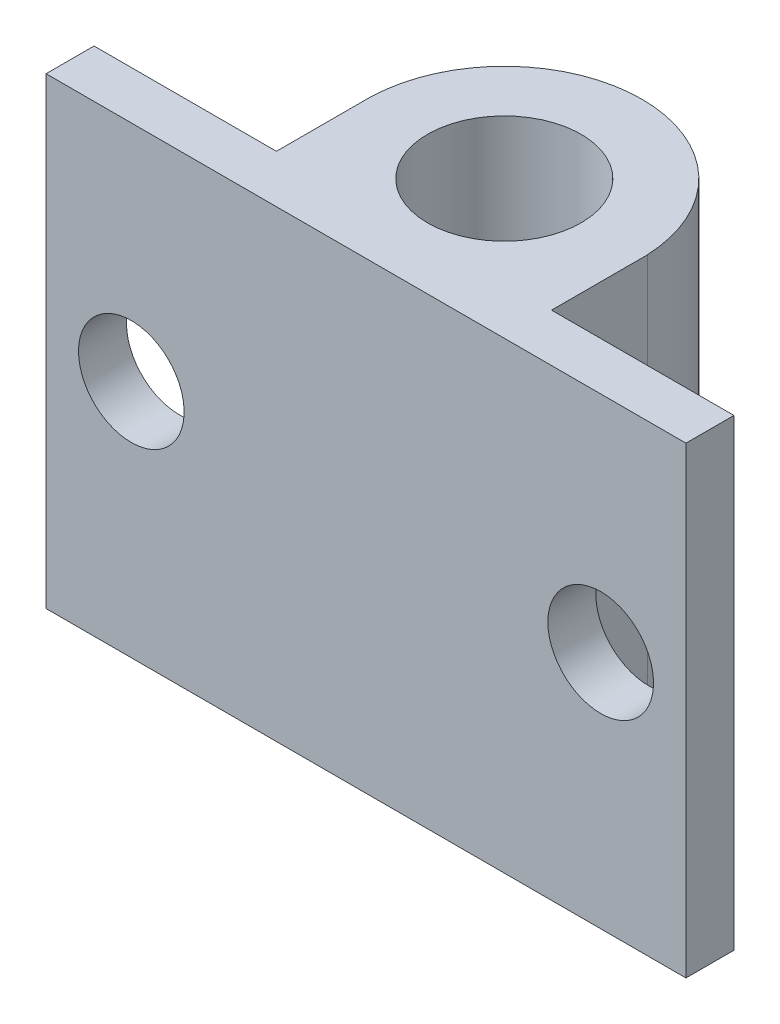
ISO-10303-21;
HEADER;
FILE_DESCRIPTION(('STEP AP214'),'2;1');
FILE_NAME('part.step','',(''),(''),'','','');
FILE_SCHEMA(('AUTOMOTIVE_DESIGN { 1 0 10303 214 1 1 1 1 }'));
ENDSEC;
DATA;
#1=APPLICATION_CONTEXT('core data for automotive mechanical design processes');
#2=APPLICATION_PROTOCOL_DEFINITION('international standard','automotive_design',2000,#1);
#3=PRODUCT_CONTEXT('',#1,'mechanical');
#4=PRODUCT('Part','Part','',(#3));
#5=PRODUCT_RELATED_PRODUCT_CATEGORY('part','',(#4));
#6=PRODUCT_DEFINITION_FORMATION('','',#4);
#7=PRODUCT_DEFINITION_CONTEXT('part definition',#1,'design');
#8=PRODUCT_DEFINITION('design','',#6,#7);
#9=PRODUCT_DEFINITION_SHAPE('','',#8);
#10=(LENGTH_UNIT() NAMED_UNIT(*) SI_UNIT(.MILLI.,.METRE.));
#11=(NAMED_UNIT(*) PLANE_ANGLE_UNIT() SI_UNIT($,.RADIAN.));
#12=(NAMED_UNIT(*) SI_UNIT($,.STERADIAN.) SOLID_ANGLE_UNIT());
#13=UNCERTAINTY_MEASURE_WITH_UNIT(LENGTH_MEASURE(1.E-05),#10,'distance_accuracy_value','');
#14=(GEOMETRIC_REPRESENTATION_CONTEXT(3) GLOBAL_UNCERTAINTY_ASSIGNED_CONTEXT((#13)) GLOBAL_UNIT_ASSIGNED_CONTEXT((#10,
#11,#12)) REPRESENTATION_CONTEXT('',''));
#15=CARTESIAN_POINT('',(0.,0.,0.));
#16=DIRECTION('',(0.,0.,1.));
#17=DIRECTION('',(1.,0.,0.));
#18=AXIS2_PLACEMENT_3D('',#15,#16,#17);
#19=CARTESIAN_POINT('',(-10.,14.478,4.32278570050431));
#20=DIRECTION('',(0.,0.,-1.));
#21=DIRECTION('',(-1.,0.,0.));
#22=AXIS2_PLACEMENT_3D('',#19,#20,#21);
#23=PLANE('',#22);
#24=CARTESIAN_POINT('',(-7.33556817238237,7.478,4.32278570050431));
#25=DIRECTION('',(0.,0.,-1.));
#26=DIRECTION('',(-1.,0.,0.));
#27=AXIS2_PLACEMENT_3D('',#24,#25,#26);
#28=CIRCLE('',#27,1.651);
#29=CARTESIAN_POINT('',(-8.98656817238237,7.478,4.32278570050431));
#30=VERTEX_POINT('',#29);
#31=EDGE_CURVE('E234',#30,#30,#28,.T.);
#32=ORIENTED_EDGE('',*,*,#31,.T.);
#33=EDGE_LOOP('',(#32));
#34=FACE_BOUND('',#33,.T.);
#35=DIRECTION('',(1.,0.,0.));
#36=VECTOR('',#35,1.);
#37=CARTESIAN_POINT('',(-10.,0.,4.32278570050431));
#38=LINE('',#37,#36);
#39=CARTESIAN_POINT('',(-10.,0.,4.32278570050431));
#40=VERTEX_POINT('',#39);
#41=CARTESIAN_POINT('',(10.,0.,4.32278570050431));
#42=VERTEX_POINT('',#41);
#43=EDGE_CURVE('E212',#40,#42,#38,.T.);
#44=ORIENTED_EDGE('',*,*,#43,.T.);
#45=DIRECTION('',(0.,-1.,0.));
#46=VECTOR('',#45,1.);
#47=CARTESIAN_POINT('',(10.,14.478,4.32278570050431));
#48=LINE('',#47,#46);
#49=CARTESIAN_POINT('',(10.,14.478,4.32278570050431));
#50=VERTEX_POINT('',#49);
#51=EDGE_CURVE('E229',#50,#42,#48,.T.);
#52=ORIENTED_EDGE('',*,*,#51,.F.);
#53=DIRECTION('',(1.,0.,0.));
#54=VECTOR('',#53,1.);
#55=CARTESIAN_POINT('',(-10.,14.478,4.32278570050431));
#56=LINE('',#55,#54);
#57=CARTESIAN_POINT('',(-10.,14.478,4.32278570050431));
#58=VERTEX_POINT('',#57);
#59=EDGE_CURVE('E197',#58,#50,#56,.T.);
#60=ORIENTED_EDGE('',*,*,#59,.F.);
#61=DIRECTION('',(0.,-1.,0.));
#62=VECTOR('',#61,1.);
#63=CARTESIAN_POINT('',(-10.,14.478,4.32278570050431));
#64=LINE('',#63,#62);
#65=EDGE_CURVE('E190',#58,#40,#64,.T.);
#66=ORIENTED_EDGE('',*,*,#65,.T.);
#67=EDGE_LOOP('',(#44,#52,#60,#66));
#68=FACE_BOUND('',#67,.T.);
#69=CARTESIAN_POINT('',(7.33556817238237,7.478,4.32278570050431));
#70=DIRECTION('',(0.,0.,-1.));
#71=DIRECTION('',(-1.,0.,0.));
#72=AXIS2_PLACEMENT_3D('',#69,#70,#71);
#73=CIRCLE('',#72,1.651);
#74=CARTESIAN_POINT('',(5.68456817238237,7.478,4.32278570050431));
#75=VERTEX_POINT('',#74);
#76=EDGE_CURVE('E45',#75,#75,#73,.F.);
#77=ORIENTED_EDGE('',*,*,#76,.F.);
#78=EDGE_LOOP('',(#77));
#79=FACE_BOUND('',#78,.T.);
#80=ADVANCED_FACE('F41',(#34,#68,#79),#23,.F.);
#81=CARTESIAN_POINT('',(-10.,14.478,2.82278570050431));
#82=DIRECTION('',(0.,0.,-1.));
#83=DIRECTION('',(-1.,0.,0.));
#84=AXIS2_PLACEMENT_3D('',#81,#82,#83);
#85=PLANE('',#84);
#86=CARTESIAN_POINT('',(-7.33556817238237,7.478,2.82278570050431));
#87=DIRECTION('',(0.,0.,-1.));
#88=DIRECTION('',(-1.,0.,0.));
#89=AXIS2_PLACEMENT_3D('',#86,#87,#88);
#90=CIRCLE('',#89,1.651);
#91=CARTESIAN_POINT('',(-8.98656817238237,7.478,2.82278570050431));
#92=VERTEX_POINT('',#91);
#93=EDGE_CURVE('E244',#92,#92,#90,.T.);
#94=ORIENTED_EDGE('',*,*,#93,.F.);
#95=EDGE_LOOP('',(#94));
#96=FACE_BOUND('',#95,.T.);
#97=DIRECTION('',(1.,0.,0.));
#98=VECTOR('',#97,1.);
#99=CARTESIAN_POINT('',(-10.,14.478,2.82278570050431));
#100=LINE('',#99,#98);
#101=CARTESIAN_POINT('',(-10.,14.478,2.82278570050431));
#102=VERTEX_POINT('',#101);
#103=CARTESIAN_POINT('',(-4.3,14.478,2.82278570050431));
#104=VERTEX_POINT('',#103);
#105=EDGE_CURVE('E205',#102,#104,#100,.T.);
#106=ORIENTED_EDGE('',*,*,#105,.T.);
#107=DIRECTION('',(0.,1.,0.));
#108=VECTOR('',#107,1.);
#109=CARTESIAN_POINT('',(-4.3,14.478,2.82278570050431));
#110=LINE('',#109,#108);
#111=CARTESIAN_POINT('',(-4.3,0.,2.82278570050431));
#112=VERTEX_POINT('',#111);
#113=EDGE_CURVE('E142',#112,#104,#110,.T.);
#114=ORIENTED_EDGE('',*,*,#113,.F.);
#115=DIRECTION('',(1.,0.,0.));
#116=VECTOR('',#115,1.);
#117=CARTESIAN_POINT('',(-10.,0.,2.82278570050431));
#118=LINE('',#117,#116);
#119=CARTESIAN_POINT('',(-10.,0.,2.82278570050431));
#120=VERTEX_POINT('',#119);
#121=EDGE_CURVE('E128',#120,#112,#118,.T.);
#122=ORIENTED_EDGE('',*,*,#121,.F.);
#123=DIRECTION('',(0.,-1.,0.));
#124=VECTOR('',#123,1.);
#125=CARTESIAN_POINT('',(-10.,14.478,2.82278570050431));
#126=LINE('',#125,#124);
#127=EDGE_CURVE('E208',#102,#120,#126,.T.);
#128=ORIENTED_EDGE('',*,*,#127,.F.);
#129=EDGE_LOOP('',(#106,#114,#122,#128));
#130=FACE_BOUND('',#129,.T.);
#131=ADVANCED_FACE('F255',(#96,#130),#85,.T.);
#132=CARTESIAN_POINT('',(0.,14.478,0.));
#133=DIRECTION('',(0.,-1.,0.));
#134=DIRECTION('',(0.,0.,-1.));
#135=AXIS2_PLACEMENT_3D('',#132,#133,#134);
#136=CYLINDRICAL_SURFACE('',#135,4.3);
#137=CARTESIAN_POINT('',(0.,0.,0.));
#138=DIRECTION('',(0.,1.,0.));
#139=DIRECTION('',(0.,0.,1.));
#140=AXIS2_PLACEMENT_3D('',#137,#138,#139);
#141=CIRCLE('',#140,4.3);
#142=CARTESIAN_POINT('',(4.2963467146,0.,-0.177214299495691));
#143=VERTEX_POINT('',#142);
#144=CARTESIAN_POINT('',(-4.2963467146,0.,-0.177214299495691));
#145=VERTEX_POINT('',#144);
#146=EDGE_CURVE('E63',#143,#145,#141,.T.);
#147=ORIENTED_EDGE('',*,*,#146,.T.);
#148=DIRECTION('',(0.,-1.,0.));
#149=VECTOR('',#148,1.);
#150=CARTESIAN_POINT('',(-4.2963467146,14.478,-0.177214299495691));
#151=LINE('',#150,#149);
#152=CARTESIAN_POINT('',(-4.2963467146,14.478,-0.177214299495691));
#153=VERTEX_POINT('',#152);
#154=EDGE_CURVE('E59',#145,#153,#151,.F.);
#155=ORIENTED_EDGE('',*,*,#154,.T.);
#156=CARTESIAN_POINT('',(0.,14.478,0.));
#157=DIRECTION('',(0.,1.,0.));
#158=DIRECTION('',(0.,0.,1.));
#159=AXIS2_PLACEMENT_3D('',#156,#157,#158);
#160=CIRCLE('',#159,4.3);
#161=CARTESIAN_POINT('',(4.2963467146,14.478,-0.177214299495691));
#162=VERTEX_POINT('',#161);
#163=EDGE_CURVE('E11',#162,#153,#160,.T.);
#164=ORIENTED_EDGE('',*,*,#163,.F.);
#165=DIRECTION('',(0.,-1.,0.));
#166=VECTOR('',#165,1.);
#167=CARTESIAN_POINT('',(4.2963467146,14.478,-0.177214299495691));
#168=LINE('',#167,#166);
#169=EDGE_CURVE('E179',#143,#162,#168,.F.);
#170=ORIENTED_EDGE('',*,*,#169,.F.);
#171=EDGE_LOOP('',(#147,#155,#164,#170));
#172=FACE_BOUND('',#171,.T.);
#173=ADVANCED_FACE('F258',(#172),#136,.T.);
#174=CARTESIAN_POINT('',(7.33556817238237,7.478,2.82278570050431));
#175=DIRECTION('',(0.,0.,-1.));
#176=DIRECTION('',(-1.,0.,0.));
#177=AXIS2_PLACEMENT_3D('',#174,#175,#176);
#178=CIRCLE('',#177,1.651);
#179=CARTESIAN_POINT('',(5.68456817238237,7.478,2.82278570050431));
#180=VERTEX_POINT('',#179);
#181=EDGE_CURVE('E237',#180,#180,#178,.F.);
#182=ORIENTED_EDGE('',*,*,#181,.T.);
#183=EDGE_LOOP('',(#182));
#184=FACE_BOUND('',#183,.T.);
#185=CARTESIAN_POINT('',(4.3,0.,2.82278570050431));
#186=VERTEX_POINT('',#185);
#187=CARTESIAN_POINT('',(10.,0.,2.82278570050431));
#188=VERTEX_POINT('',#187);
#189=EDGE_CURVE('E220',#186,#188,#118,.T.);
#190=ORIENTED_EDGE('',*,*,#189,.F.);
#191=DIRECTION('',(0.,-1.,0.));
#192=VECTOR('',#191,1.);
#193=CARTESIAN_POINT('',(4.3,14.478,2.82278570050431));
#194=LINE('',#193,#192);
#195=CARTESIAN_POINT('',(4.3,14.478,2.82278570050431));
#196=VERTEX_POINT('',#195);
#197=EDGE_CURVE('E159',#196,#186,#194,.T.);
#198=ORIENTED_EDGE('',*,*,#197,.F.);
#199=CARTESIAN_POINT('',(10.,14.478,2.82278570050431));
#200=VERTEX_POINT('',#199);
#201=EDGE_CURVE('E204',#196,#200,#100,.T.);
#202=ORIENTED_EDGE('',*,*,#201,.T.);
#203=DIRECTION('',(0.,-1.,0.));
#204=VECTOR('',#203,1.);
#205=CARTESIAN_POINT('',(10.,14.478,2.82278570050431));
#206=LINE('',#205,#204);
#207=EDGE_CURVE('E225',#200,#188,#206,.T.);
#208=ORIENTED_EDGE('',*,*,#207,.T.);
#209=EDGE_LOOP('',(#190,#198,#202,#208));
#210=FACE_BOUND('',#209,.T.);
#211=ADVANCED_FACE('F260',(#184,#210),#85,.T.);
#212=CARTESIAN_POINT('',(0.,14.478,0.));
#213=DIRECTION('',(0.,-1.,0.));
#214=DIRECTION('',(0.,0.,-1.));
#215=AXIS2_PLACEMENT_3D('',#212,#213,#214);
#216=CYLINDRICAL_SURFACE('',#215,2.4);
#217=CARTESIAN_POINT('',(0.,14.478,0.));
#218=DIRECTION('',(0.,1.,0.));
#219=DIRECTION('',(0.,0.,1.));
#220=AXIS2_PLACEMENT_3D('',#217,#218,#219);
#221=CIRCLE('',#220,2.4);
#222=CARTESIAN_POINT('',(0.,14.478,2.4));
#223=VERTEX_POINT('',#222);
#224=EDGE_CURVE('E51',#223,#223,#221,.T.);
#225=ORIENTED_EDGE('',*,*,#224,.T.);
#226=EDGE_LOOP('',(#225));
#227=FACE_BOUND('',#226,.T.);
#228=CARTESIAN_POINT('',(0.,0.,0.));
#229=DIRECTION('',(0.,1.,0.));
#230=DIRECTION('',(0.,0.,1.));
#231=AXIS2_PLACEMENT_3D('',#228,#229,#230);
#232=CIRCLE('',#231,2.4);
#233=CARTESIAN_POINT('',(0.,0.,2.4));
#234=VERTEX_POINT('',#233);
#235=EDGE_CURVE('E186',#234,#234,#232,.T.);
#236=ORIENTED_EDGE('',*,*,#235,.F.);
#237=EDGE_LOOP('',(#236));
#238=FACE_BOUND('',#237,.T.);
#239=ADVANCED_FACE('F297',(#227,#238),#216,.F.);
#240=CARTESIAN_POINT('',(0.,14.478,0.));
#241=DIRECTION('',(0.,1.,0.));
#242=DIRECTION('',(0.,0.,1.));
#243=AXIS2_PLACEMENT_3D('',#240,#241,#242);
#244=PLANE('',#243);
#245=DIRECTION('',(1.,0.,0.));
#246=VECTOR('',#245,1.);
#247=CARTESIAN_POINT('',(-3.24374488655141,14.478,-0.177214299495691));
#248=LINE('',#247,#246);
#249=CARTESIAN_POINT('',(-4.3,14.478,-0.177214299495691));
#250=VERTEX_POINT('',#249);
#251=EDGE_CURVE('E147',#250,#153,#248,.T.);
#252=ORIENTED_EDGE('',*,*,#251,.F.);
#253=DIRECTION('',(0.,0.,1.));
#254=VECTOR('',#253,1.);
#255=CARTESIAN_POINT('',(-4.3,14.478,-0.177214299495691));
#256=LINE('',#255,#254);
#257=EDGE_CURVE('E133',#250,#104,#256,.T.);
#258=ORIENTED_EDGE('',*,*,#257,.T.);
#259=ORIENTED_EDGE('',*,*,#105,.F.);
#260=DIRECTION('',(0.,0.,1.));
#261=VECTOR('',#260,1.);
#262=CARTESIAN_POINT('',(-10.,14.478,2.82278570050431));
#263=LINE('',#262,#261);
#264=EDGE_CURVE('E193',#102,#58,#263,.T.);
#265=ORIENTED_EDGE('',*,*,#264,.T.);
#266=ORIENTED_EDGE('',*,*,#59,.T.);
#267=DIRECTION('',(0.,0.,1.));
#268=VECTOR('',#267,1.);
#269=CARTESIAN_POINT('',(10.,14.478,2.82278570050431));
#270=LINE('',#269,#268);
#271=EDGE_CURVE('E200',#200,#50,#270,.T.);
#272=ORIENTED_EDGE('',*,*,#271,.F.);
#273=ORIENTED_EDGE('',*,*,#201,.F.);
#274=DIRECTION('',(0.,0.,1.));
#275=VECTOR('',#274,1.);
#276=CARTESIAN_POINT('',(4.3,14.478,-0.177214299495691));
#277=LINE('',#276,#275);
#278=CARTESIAN_POINT('',(4.3,14.478,-0.177214299495691));
#279=VERTEX_POINT('',#278);
#280=EDGE_CURVE('E176',#279,#196,#277,.T.);
#281=ORIENTED_EDGE('',*,*,#280,.F.);
#282=DIRECTION('',(1.,0.,0.));
#283=VECTOR('',#282,1.);
#284=CARTESIAN_POINT('',(3.24374488655141,14.478,-0.177214299495691));
#285=LINE('',#284,#283);
#286=EDGE_CURVE('E160',#162,#279,#285,.T.);
#287=ORIENTED_EDGE('',*,*,#286,.F.);
#288=ORIENTED_EDGE('',*,*,#163,.T.);
#289=EDGE_LOOP('',(#252,#258,#259,#265,#266,#272,#273,#281,#287,#288));
#290=FACE_BOUND('',#289,.T.);
#291=ORIENTED_EDGE('',*,*,#224,.F.);
#292=EDGE_LOOP('',(#291));
#293=FACE_BOUND('',#292,.T.);
#294=ADVANCED_FACE('F264',(#290,#293),#244,.T.);
#295=CARTESIAN_POINT('',(0.,0.,0.));
#296=DIRECTION('',(0.,1.,0.));
#297=DIRECTION('',(0.,0.,1.));
#298=AXIS2_PLACEMENT_3D('',#295,#296,#297);
#299=PLANE('',#298);
#300=DIRECTION('',(0.,0.,1.));
#301=VECTOR('',#300,1.);
#302=CARTESIAN_POINT('',(-4.3,0.,-0.177214299495691));
#303=LINE('',#302,#301);
#304=CARTESIAN_POINT('',(-4.3,0.,-0.177214299495691));
#305=VERTEX_POINT('',#304);
#306=EDGE_CURVE('E121',#305,#112,#303,.T.);
#307=ORIENTED_EDGE('',*,*,#306,.F.);
#308=DIRECTION('',(-1.,0.,0.));
#309=VECTOR('',#308,1.);
#310=CARTESIAN_POINT('',(-3.24374488655141,0.,-0.177214299495691));
#311=LINE('',#310,#309);
#312=EDGE_CURVE('E125',#145,#305,#311,.T.);
#313=ORIENTED_EDGE('',*,*,#312,.F.);
#314=ORIENTED_EDGE('',*,*,#146,.F.);
#315=DIRECTION('',(-1.,0.,0.));
#316=VECTOR('',#315,1.);
#317=CARTESIAN_POINT('',(3.24374488655141,0.,-0.177214299495691));
#318=LINE('',#317,#316);
#319=CARTESIAN_POINT('',(4.3,0.,-0.177214299495691));
#320=VERTEX_POINT('',#319);
#321=EDGE_CURVE('E167',#320,#143,#318,.T.);
#322=ORIENTED_EDGE('',*,*,#321,.F.);
#323=DIRECTION('',(0.,0.,1.));
#324=VECTOR('',#323,1.);
#325=CARTESIAN_POINT('',(4.3,0.,-0.177214299495691));
#326=LINE('',#325,#324);
#327=EDGE_CURVE('E170',#320,#186,#326,.T.);
#328=ORIENTED_EDGE('',*,*,#327,.T.);
#329=ORIENTED_EDGE('',*,*,#189,.T.);
#330=DIRECTION('',(0.,0.,1.));
#331=VECTOR('',#330,1.);
#332=CARTESIAN_POINT('',(10.,0.,2.82278570050431));
#333=LINE('',#332,#331);
#334=EDGE_CURVE('E216',#188,#42,#333,.T.);
#335=ORIENTED_EDGE('',*,*,#334,.T.);
#336=ORIENTED_EDGE('',*,*,#43,.F.);
#337=DIRECTION('',(0.,0.,1.));
#338=VECTOR('',#337,1.);
#339=CARTESIAN_POINT('',(-10.,0.,2.82278570050431));
#340=LINE('',#339,#338);
#341=EDGE_CURVE('E182',#120,#40,#340,.T.);
#342=ORIENTED_EDGE('',*,*,#341,.F.);
#343=ORIENTED_EDGE('',*,*,#121,.T.);
#344=EDGE_LOOP('',(#307,#313,#314,#322,#328,#329,#335,#336,#342,#343));
#345=FACE_BOUND('',#344,.T.);
#346=ORIENTED_EDGE('',*,*,#235,.T.);
#347=EDGE_LOOP('',(#346));
#348=FACE_BOUND('',#347,.T.);
#349=ADVANCED_FACE('F123',(#345,#348),#299,.F.);
#350=CARTESIAN_POINT('',(10.,14.478,2.82278570050431));
#351=DIRECTION('',(1.,0.,0.));
#352=DIRECTION('',(0.,0.,-1.));
#353=AXIS2_PLACEMENT_3D('',#350,#351,#352);
#354=PLANE('',#353);
#355=ORIENTED_EDGE('',*,*,#334,.F.);
#356=ORIENTED_EDGE('',*,*,#207,.F.);
#357=ORIENTED_EDGE('',*,*,#271,.T.);
#358=ORIENTED_EDGE('',*,*,#51,.T.);
#359=EDGE_LOOP('',(#355,#356,#357,#358));
#360=FACE_BOUND('',#359,.T.);
#361=ADVANCED_FACE('F284',(#360),#354,.T.);
#362=CARTESIAN_POINT('',(-10.,14.478,2.82278570050431));
#363=DIRECTION('',(1.,0.,0.));
#364=DIRECTION('',(0.,0.,-1.));
#365=AXIS2_PLACEMENT_3D('',#362,#363,#364);
#366=PLANE('',#365);
#367=ORIENTED_EDGE('',*,*,#341,.T.);
#368=ORIENTED_EDGE('',*,*,#65,.F.);
#369=ORIENTED_EDGE('',*,*,#264,.F.);
#370=ORIENTED_EDGE('',*,*,#127,.T.);
#371=EDGE_LOOP('',(#367,#368,#369,#370));
#372=FACE_BOUND('',#371,.T.);
#373=ADVANCED_FACE('F43',(#372),#366,.F.);
#374=CARTESIAN_POINT('',(0.,0.,-0.177214299495691));
#375=DIRECTION('',(0.,0.,1.));
#376=DIRECTION('',(1.,0.,0.));
#377=AXIS2_PLACEMENT_3D('',#374,#375,#376);
#378=PLANE('',#377);
#379=ORIENTED_EDGE('',*,*,#321,.T.);
#380=ORIENTED_EDGE('',*,*,#169,.T.);
#381=ORIENTED_EDGE('',*,*,#286,.T.);
#382=DIRECTION('',(0.,-1.,0.));
#383=VECTOR('',#382,1.);
#384=CARTESIAN_POINT('',(4.3,14.478,-0.177214299495691));
#385=LINE('',#384,#383);
#386=EDGE_CURVE('E163',#279,#320,#385,.T.);
#387=ORIENTED_EDGE('',*,*,#386,.T.);
#388=EDGE_LOOP('',(#379,#380,#381,#387));
#389=FACE_BOUND('',#388,.T.);
#390=ADVANCED_FACE('F271',(#389),#378,.F.);
#391=CARTESIAN_POINT('',(4.3,14.478,-0.177214299495691));
#392=DIRECTION('',(-1.,0.,0.));
#393=DIRECTION('',(0.,0.,1.));
#394=AXIS2_PLACEMENT_3D('',#391,#392,#393);
#395=PLANE('',#394);
#396=ORIENTED_EDGE('',*,*,#280,.T.);
#397=ORIENTED_EDGE('',*,*,#197,.T.);
#398=ORIENTED_EDGE('',*,*,#327,.F.);
#399=ORIENTED_EDGE('',*,*,#386,.F.);
#400=EDGE_LOOP('',(#396,#397,#398,#399));
#401=FACE_BOUND('',#400,.T.);
#402=ADVANCED_FACE('F274',(#401),#395,.F.);
#403=CARTESIAN_POINT('',(0.,0.,-0.177214299495691));
#404=DIRECTION('',(0.,0.,-1.));
#405=DIRECTION('',(-1.,0.,0.));
#406=AXIS2_PLACEMENT_3D('',#403,#404,#405);
#407=PLANE('',#406);
#408=ORIENTED_EDGE('',*,*,#154,.F.);
#409=ORIENTED_EDGE('',*,*,#312,.T.);
#410=DIRECTION('',(0.,1.,0.));
#411=VECTOR('',#410,1.);
#412=CARTESIAN_POINT('',(-4.3,14.478,-0.177214299495691));
#413=LINE('',#412,#411);
#414=EDGE_CURVE('E139',#305,#250,#413,.T.);
#415=ORIENTED_EDGE('',*,*,#414,.T.);
#416=ORIENTED_EDGE('',*,*,#251,.T.);
#417=EDGE_LOOP('',(#408,#409,#415,#416));
#418=FACE_BOUND('',#417,.T.);
#419=ADVANCED_FACE('F137',(#418),#407,.T.);
#420=CARTESIAN_POINT('',(-4.3,14.478,-0.177214299495691));
#421=DIRECTION('',(1.,0.,0.));
#422=DIRECTION('',(0.,0.,-1.));
#423=AXIS2_PLACEMENT_3D('',#420,#421,#422);
#424=PLANE('',#423);
#425=ORIENTED_EDGE('',*,*,#257,.F.);
#426=ORIENTED_EDGE('',*,*,#414,.F.);
#427=ORIENTED_EDGE('',*,*,#306,.T.);
#428=ORIENTED_EDGE('',*,*,#113,.T.);
#429=EDGE_LOOP('',(#425,#426,#427,#428));
#430=FACE_BOUND('',#429,.T.);
#431=ADVANCED_FACE('F144',(#430),#424,.F.);
#432=CARTESIAN_POINT('',(-7.33556817238237,7.478,5.82278570050431));
#433=DIRECTION('',(0.,0.,-1.));
#434=DIRECTION('',(-1.,0.,0.));
#435=AXIS2_PLACEMENT_3D('',#432,#433,#434);
#436=CYLINDRICAL_SURFACE('',#435,1.651);
#437=ORIENTED_EDGE('',*,*,#93,.T.);
#438=EDGE_LOOP('',(#437));
#439=FACE_BOUND('',#438,.T.);
#440=ORIENTED_EDGE('',*,*,#31,.F.);
#441=EDGE_LOOP('',(#440));
#442=FACE_BOUND('',#441,.T.);
#443=ADVANCED_FACE('F252',(#439,#442),#436,.F.);
#444=CARTESIAN_POINT('',(7.33556817238237,7.478,5.82278570050431));
#445=DIRECTION('',(0.,0.,-1.));
#446=DIRECTION('',(-1.,0.,0.));
#447=AXIS2_PLACEMENT_3D('',#444,#445,#446);
#448=CYLINDRICAL_SURFACE('',#447,1.651);
#449=ORIENTED_EDGE('',*,*,#181,.F.);
#450=EDGE_LOOP('',(#449));
#451=FACE_BOUND('',#450,.T.);
#452=ORIENTED_EDGE('',*,*,#76,.T.);
#453=EDGE_LOOP('',(#452));
#454=FACE_BOUND('',#453,.T.);
#455=ADVANCED_FACE('F320',(#451,#454),#448,.F.);
#456=CLOSED_SHELL('',(#80,#131,#173,#211,#239,#294,#349,#361,#373,#390,#402,#419,#431,#443,#455));
#457=MANIFOLD_SOLID_BREP('B2',#456);
#458=ADVANCED_BREP_SHAPE_REPRESENTATION('',(#18,#457),#14);
#459=SHAPE_DEFINITION_REPRESENTATION(#9,#458);
ENDSEC;
END-ISO-10303-21;
